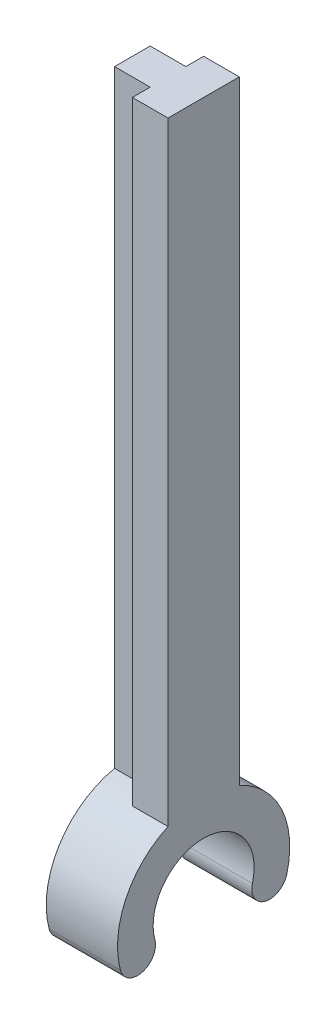
ISO-10303-21;
HEADER;
FILE_DESCRIPTION(('STEP AP214'),'2;1');
FILE_NAME('part.step','',(''),(''),'','','');
FILE_SCHEMA(('AUTOMOTIVE_DESIGN { 1 0 10303 214 1 1 1 1 }'));
ENDSEC;
DATA;
#1=APPLICATION_CONTEXT('core data for automotive mechanical design processes');
#2=APPLICATION_PROTOCOL_DEFINITION('international standard','automotive_design',2000,#1);
#3=PRODUCT_CONTEXT('',#1,'mechanical');
#4=PRODUCT('Part','Part','',(#3));
#5=PRODUCT_RELATED_PRODUCT_CATEGORY('part','',(#4));
#6=PRODUCT_DEFINITION_FORMATION('','',#4);
#7=PRODUCT_DEFINITION_CONTEXT('part definition',#1,'design');
#8=PRODUCT_DEFINITION('design','',#6,#7);
#9=PRODUCT_DEFINITION_SHAPE('','',#8);
#10=(LENGTH_UNIT() NAMED_UNIT(*) SI_UNIT(.MILLI.,.METRE.));
#11=(NAMED_UNIT(*) PLANE_ANGLE_UNIT() SI_UNIT($,.RADIAN.));
#12=(NAMED_UNIT(*) SI_UNIT($,.STERADIAN.) SOLID_ANGLE_UNIT());
#13=UNCERTAINTY_MEASURE_WITH_UNIT(LENGTH_MEASURE(1.E-05),#10,'distance_accuracy_value','');
#14=(GEOMETRIC_REPRESENTATION_CONTEXT(3) GLOBAL_UNCERTAINTY_ASSIGNED_CONTEXT((#13)) GLOBAL_UNIT_ASSIGNED_CONTEXT((#10,
#11,#12)) REPRESENTATION_CONTEXT('',''));
#15=CARTESIAN_POINT('',(0.,0.,0.));
#16=DIRECTION('',(0.,0.,1.));
#17=DIRECTION('',(1.,0.,0.));
#18=AXIS2_PLACEMENT_3D('',#15,#16,#17);
#19=CARTESIAN_POINT('',(3.,0.,0.));
#20=DIRECTION('',(-1.,0.,0.));
#21=DIRECTION('',(0.,0.,1.));
#22=AXIS2_PLACEMENT_3D('',#19,#20,#21);
#23=CYLINDRICAL_SURFACE('',#22,7.25);
#24=DIRECTION('',(-1.,0.,0.));
#25=VECTOR('',#24,1.);
#26=CARTESIAN_POINT('',(3.,7.09313047955555,-1.50000000000001));
#27=LINE('',#26,#25);
#28=CARTESIAN_POINT('',(0.,7.09313047955555,-1.50000000000001));
#29=VERTEX_POINT('',#28);
#30=CARTESIAN_POINT('',(-3.,7.09313047955555,-1.50000000000001));
#31=VERTEX_POINT('',#30);
#32=EDGE_CURVE('E157',#29,#31,#27,.T.);
#33=ORIENTED_EDGE('',*,*,#32,.F.);
#34=CARTESIAN_POINT('',(0.,0.,0.));
#35=DIRECTION('',(1.,0.,0.));
#36=DIRECTION('',(0.,0.,-1.));
#37=AXIS2_PLACEMENT_3D('',#34,#35,#36);
#38=CIRCLE('',#37,7.25);
#39=CARTESIAN_POINT('',(0.,6.60018939122204,-3.));
#40=VERTEX_POINT('',#39);
#41=EDGE_CURVE('E11',#40,#29,#38,.T.);
#42=ORIENTED_EDGE('',*,*,#41,.F.);
#43=DIRECTION('',(-1.,0.,0.));
#44=VECTOR('',#43,1.);
#45=CARTESIAN_POINT('',(3.,6.60018939122204,-3.));
#46=LINE('',#45,#44);
#47=CARTESIAN_POINT('',(3.,6.60018939122204,-3.));
#48=VERTEX_POINT('',#47);
#49=EDGE_CURVE('E206',#48,#40,#46,.T.);
#50=ORIENTED_EDGE('',*,*,#49,.F.);
#51=CARTESIAN_POINT('',(3.,0.,0.));
#52=DIRECTION('',(1.,0.,0.));
#53=DIRECTION('',(0.,0.,-1.));
#54=AXIS2_PLACEMENT_3D('',#51,#52,#53);
#55=CIRCLE('',#54,7.25);
#56=CARTESIAN_POINT('',(3.,-1.87643807699328,-7.00296224059574));
#57=VERTEX_POINT('',#56);
#58=EDGE_CURVE('E234',#57,#48,#55,.T.);
#59=ORIENTED_EDGE('',*,*,#58,.F.);
#60=DIRECTION('',(-1.,0.,0.));
#61=VECTOR('',#60,1.);
#62=CARTESIAN_POINT('',(3.,-1.87643807699328,-7.00296224059574));
#63=LINE('',#62,#61);
#64=CARTESIAN_POINT('',(-3.,-1.87643807699328,-7.00296224059574));
#65=VERTEX_POINT('',#64);
#66=EDGE_CURVE('E248',#57,#65,#63,.T.);
#67=ORIENTED_EDGE('',*,*,#66,.T.);
#68=CARTESIAN_POINT('',(-3.,0.,0.));
#69=DIRECTION('',(1.,0.,0.));
#70=DIRECTION('',(0.,0.,-1.));
#71=AXIS2_PLACEMENT_3D('',#68,#69,#70);
#72=CIRCLE('',#71,7.25);
#73=EDGE_CURVE('E65',#65,#31,#72,.T.);
#74=ORIENTED_EDGE('',*,*,#73,.T.);
#75=EDGE_LOOP('',(#33,#42,#50,#59,#67,#74));
#76=FACE_BOUND('',#75,.T.);
#77=ADVANCED_FACE('F41',(#76),#23,.T.);
#78=CARTESIAN_POINT('',(0.,0.,0.));
#79=DIRECTION('',(1.,0.,0.));
#80=DIRECTION('',(0.,0.,-1.));
#81=AXIS2_PLACEMENT_3D('',#78,#79,#80);
#82=PLANE('',#81);
#83=DIRECTION('',(0.,-1.,0.));
#84=VECTOR('',#83,1.);
#85=CARTESIAN_POINT('',(0.,0.,-1.50000000000001));
#86=LINE('',#85,#84);
#87=CARTESIAN_POINT('',(0.,58.25,-1.5));
#88=VERTEX_POINT('',#87);
#89=EDGE_CURVE('E162',#88,#29,#86,.T.);
#90=ORIENTED_EDGE('',*,*,#89,.F.);
#91=DIRECTION('',(0.,0.,-1.));
#92=VECTOR('',#91,1.);
#93=CARTESIAN_POINT('',(0.,58.25,0.));
#94=LINE('',#93,#92);
#95=CARTESIAN_POINT('',(0.,58.25,-3.));
#96=VERTEX_POINT('',#95);
#97=EDGE_CURVE('E149',#88,#96,#94,.T.);
#98=ORIENTED_EDGE('',*,*,#97,.T.);
#99=DIRECTION('',(0.,1.,0.));
#100=VECTOR('',#99,1.);
#101=CARTESIAN_POINT('',(0.,0.,-3.));
#102=LINE('',#101,#100);
#103=EDGE_CURVE('E175',#40,#96,#102,.T.);
#104=ORIENTED_EDGE('',*,*,#103,.F.);
#105=ORIENTED_EDGE('',*,*,#41,.T.);
#106=EDGE_LOOP('',(#90,#98,#104,#105));
#107=FACE_BOUND('',#106,.T.);
#108=ADVANCED_FACE('F276',(#107),#82,.F.);
#109=CARTESIAN_POINT('',(0.,7.09313047955556,1.49999999999999));
#110=VERTEX_POINT('',#109);
#111=CARTESIAN_POINT('',(0.,6.60018939122204,3.));
#112=VERTEX_POINT('',#111);
#113=EDGE_CURVE('E50',#110,#112,#38,.T.);
#114=ORIENTED_EDGE('',*,*,#113,.F.);
#115=DIRECTION('',(-1.,0.,0.));
#116=VECTOR('',#115,1.);
#117=CARTESIAN_POINT('',(3.,7.09313047955556,1.49999999999999));
#118=LINE('',#117,#116);
#119=CARTESIAN_POINT('',(-3.,7.09313047955556,1.49999999999999));
#120=VERTEX_POINT('',#119);
#121=EDGE_CURVE('E57',#110,#120,#118,.T.);
#122=ORIENTED_EDGE('',*,*,#121,.T.);
#123=CARTESIAN_POINT('',(-3.,-1.87643807699328,7.00296224059574));
#124=VERTEX_POINT('',#123);
#125=EDGE_CURVE('E218',#120,#124,#72,.T.);
#126=ORIENTED_EDGE('',*,*,#125,.T.);
#127=DIRECTION('',(-1.,0.,0.));
#128=VECTOR('',#127,1.);
#129=CARTESIAN_POINT('',(3.,-1.87643807699328,7.00296224059574));
#130=LINE('',#129,#128);
#131=CARTESIAN_POINT('',(3.,-1.87643807699328,7.00296224059574));
#132=VERTEX_POINT('',#131);
#133=EDGE_CURVE('E244',#132,#124,#130,.T.);
#134=ORIENTED_EDGE('',*,*,#133,.F.);
#135=CARTESIAN_POINT('',(3.,6.60018939122204,3.));
#136=VERTEX_POINT('',#135);
#137=EDGE_CURVE('E233',#136,#132,#55,.T.);
#138=ORIENTED_EDGE('',*,*,#137,.F.);
#139=DIRECTION('',(-1.,0.,0.));
#140=VECTOR('',#139,1.);
#141=CARTESIAN_POINT('',(3.,6.60018939122204,3.));
#142=LINE('',#141,#140);
#143=EDGE_CURVE('E202',#136,#112,#142,.T.);
#144=ORIENTED_EDGE('',*,*,#143,.T.);
#145=EDGE_LOOP('',(#114,#122,#126,#134,#138,#144));
#146=FACE_BOUND('',#145,.T.);
#147=ADVANCED_FACE('F260',(#146),#23,.T.);
#148=CARTESIAN_POINT('',(3.,0.,0.));
#149=DIRECTION('',(-1.,0.,0.));
#150=DIRECTION('',(0.,0.,1.));
#151=AXIS2_PLACEMENT_3D('',#148,#149,#150);
#152=CYLINDRICAL_SURFACE('',#151,4.25);
#153=DIRECTION('',(-1.,0.,0.));
#154=VECTOR('',#153,1.);
#155=CARTESIAN_POINT('',(3.,-1.09998094168572,4.10518476172854));
#156=LINE('',#155,#154);
#157=CARTESIAN_POINT('',(3.,-1.09998094168572,4.10518476172854));
#158=VERTEX_POINT('',#157);
#159=CARTESIAN_POINT('',(-3.,-1.09998094168572,4.10518476172854));
#160=VERTEX_POINT('',#159);
#161=EDGE_CURVE('E241',#158,#160,#156,.T.);
#162=ORIENTED_EDGE('',*,*,#161,.T.);
#163=CARTESIAN_POINT('',(-3.,0.,0.));
#164=DIRECTION('',(1.,0.,0.));
#165=DIRECTION('',(0.,0.,-1.));
#166=AXIS2_PLACEMENT_3D('',#163,#164,#165);
#167=CIRCLE('',#166,4.25);
#168=CARTESIAN_POINT('',(-3.,-1.09998094168572,-4.10518476172854));
#169=VERTEX_POINT('',#168);
#170=EDGE_CURVE('E210',#169,#160,#167,.T.);
#171=ORIENTED_EDGE('',*,*,#170,.F.);
#172=DIRECTION('',(-1.,0.,0.));
#173=VECTOR('',#172,1.);
#174=CARTESIAN_POINT('',(3.,-1.09998094168572,-4.10518476172854));
#175=LINE('',#174,#173);
#176=CARTESIAN_POINT('',(3.,-1.09998094168572,-4.10518476172854));
#177=VERTEX_POINT('',#176);
#178=EDGE_CURVE('E250',#177,#169,#175,.T.);
#179=ORIENTED_EDGE('',*,*,#178,.F.);
#180=CARTESIAN_POINT('',(3.,0.,0.));
#181=DIRECTION('',(1.,0.,0.));
#182=DIRECTION('',(0.,0.,-1.));
#183=AXIS2_PLACEMENT_3D('',#180,#181,#182);
#184=CIRCLE('',#183,4.25);
#185=EDGE_CURVE('E225',#177,#158,#184,.T.);
#186=ORIENTED_EDGE('',*,*,#185,.T.);
#187=EDGE_LOOP('',(#162,#171,#179,#186));
#188=FACE_BOUND('',#187,.T.);
#189=ADVANCED_FACE('F43',(#188),#152,.F.);
#190=CARTESIAN_POINT('',(3.,-1.4882095093395,-5.55407350116214));
#191=DIRECTION('',(-1.,0.,0.));
#192=DIRECTION('',(0.,0.,1.));
#193=AXIS2_PLACEMENT_3D('',#190,#191,#192);
#194=CYLINDRICAL_SURFACE('',#193,1.5);
#195=ORIENTED_EDGE('',*,*,#178,.T.);
#196=CARTESIAN_POINT('',(-3.,-1.4882095093395,-5.55407350116214));
#197=DIRECTION('',(1.,0.,0.));
#198=DIRECTION('',(0.,0.,-1.));
#199=AXIS2_PLACEMENT_3D('',#196,#197,#198);
#200=CIRCLE('',#199,1.5);
#201=EDGE_CURVE('E214',#65,#169,#200,.F.);
#202=ORIENTED_EDGE('',*,*,#201,.F.);
#203=ORIENTED_EDGE('',*,*,#66,.F.);
#204=CARTESIAN_POINT('',(3.,-1.4882095093395,-5.55407350116214));
#205=DIRECTION('',(1.,0.,0.));
#206=DIRECTION('',(0.,0.,-1.));
#207=AXIS2_PLACEMENT_3D('',#204,#205,#206);
#208=CIRCLE('',#207,1.5);
#209=EDGE_CURVE('E229',#57,#177,#208,.F.);
#210=ORIENTED_EDGE('',*,*,#209,.T.);
#211=EDGE_LOOP('',(#195,#202,#203,#210));
#212=FACE_BOUND('',#211,.T.);
#213=ADVANCED_FACE('F288',(#212),#194,.T.);
#214=CARTESIAN_POINT('',(3.,-1.4882095093395,5.55407350116214));
#215=DIRECTION('',(-1.,0.,0.));
#216=DIRECTION('',(0.,0.,1.));
#217=AXIS2_PLACEMENT_3D('',#214,#215,#216);
#218=CYLINDRICAL_SURFACE('',#217,1.5);
#219=ORIENTED_EDGE('',*,*,#133,.T.);
#220=CARTESIAN_POINT('',(-3.,-1.4882095093395,5.55407350116214));
#221=DIRECTION('',(1.,0.,0.));
#222=DIRECTION('',(0.,0.,-1.));
#223=AXIS2_PLACEMENT_3D('',#220,#221,#222);
#224=CIRCLE('',#223,1.5);
#225=EDGE_CURVE('E221',#124,#160,#224,.T.);
#226=ORIENTED_EDGE('',*,*,#225,.T.);
#227=ORIENTED_EDGE('',*,*,#161,.F.);
#228=CARTESIAN_POINT('',(3.,-1.4882095093395,5.55407350116214));
#229=DIRECTION('',(1.,0.,0.));
#230=DIRECTION('',(0.,0.,-1.));
#231=AXIS2_PLACEMENT_3D('',#228,#229,#230);
#232=CIRCLE('',#231,1.5);
#233=EDGE_CURVE('E238',#132,#158,#232,.T.);
#234=ORIENTED_EDGE('',*,*,#233,.F.);
#235=EDGE_LOOP('',(#219,#226,#227,#234));
#236=FACE_BOUND('',#235,.T.);
#237=ADVANCED_FACE('F293',(#236),#218,.T.);
#238=CARTESIAN_POINT('',(3.,0.,0.));
#239=DIRECTION('',(1.,0.,0.));
#240=DIRECTION('',(0.,0.,-1.));
#241=AXIS2_PLACEMENT_3D('',#238,#239,#240);
#242=PLANE('',#241);
#243=ORIENTED_EDGE('',*,*,#58,.T.);
#244=DIRECTION('',(0.,1.,0.));
#245=VECTOR('',#244,1.);
#246=CARTESIAN_POINT('',(3.,0.,-3.));
#247=LINE('',#246,#245);
#248=CARTESIAN_POINT('',(3.,58.25,-3.));
#249=VERTEX_POINT('',#248);
#250=EDGE_CURVE('E176',#48,#249,#247,.T.);
#251=ORIENTED_EDGE('',*,*,#250,.T.);
#252=DIRECTION('',(0.,0.,-1.));
#253=VECTOR('',#252,1.);
#254=CARTESIAN_POINT('',(3.,58.25,0.));
#255=LINE('',#254,#253);
#256=CARTESIAN_POINT('',(3.,58.25,3.));
#257=VERTEX_POINT('',#256);
#258=EDGE_CURVE('E179',#257,#249,#255,.T.);
#259=ORIENTED_EDGE('',*,*,#258,.F.);
#260=DIRECTION('',(0.,1.,0.));
#261=VECTOR('',#260,1.);
#262=CARTESIAN_POINT('',(3.,0.,3.));
#263=LINE('',#262,#261);
#264=EDGE_CURVE('E184',#136,#257,#263,.T.);
#265=ORIENTED_EDGE('',*,*,#264,.F.);
#266=ORIENTED_EDGE('',*,*,#137,.T.);
#267=ORIENTED_EDGE('',*,*,#233,.T.);
#268=ORIENTED_EDGE('',*,*,#185,.F.);
#269=ORIENTED_EDGE('',*,*,#209,.F.);
#270=EDGE_LOOP('',(#243,#251,#259,#265,#266,#267,#268,#269));
#271=FACE_BOUND('',#270,.T.);
#272=ADVANCED_FACE('F308',(#271),#242,.T.);
#273=CARTESIAN_POINT('',(-3.,0.,0.));
#274=DIRECTION('',(1.,0.,0.));
#275=DIRECTION('',(0.,0.,-1.));
#276=AXIS2_PLACEMENT_3D('',#273,#274,#275);
#277=PLANE('',#276);
#278=ORIENTED_EDGE('',*,*,#125,.F.);
#279=DIRECTION('',(0.,-1.,0.));
#280=VECTOR('',#279,1.);
#281=CARTESIAN_POINT('',(-3.,0.,1.49999999999999));
#282=LINE('',#281,#280);
#283=CARTESIAN_POINT('',(-3.,58.25,1.5));
#284=VERTEX_POINT('',#283);
#285=EDGE_CURVE('E139',#284,#120,#282,.T.);
#286=ORIENTED_EDGE('',*,*,#285,.F.);
#287=DIRECTION('',(0.,0.,-1.));
#288=VECTOR('',#287,1.);
#289=CARTESIAN_POINT('',(-3.,58.25,0.));
#290=LINE('',#289,#288);
#291=CARTESIAN_POINT('',(-3.,58.25,-1.5));
#292=VERTEX_POINT('',#291);
#293=EDGE_CURVE('E133',#284,#292,#290,.T.);
#294=ORIENTED_EDGE('',*,*,#293,.T.);
#295=DIRECTION('',(0.,-1.,0.));
#296=VECTOR('',#295,1.);
#297=CARTESIAN_POINT('',(-3.,0.,-1.50000000000001));
#298=LINE('',#297,#296);
#299=EDGE_CURVE('E137',#292,#31,#298,.T.);
#300=ORIENTED_EDGE('',*,*,#299,.T.);
#301=ORIENTED_EDGE('',*,*,#73,.F.);
#302=ORIENTED_EDGE('',*,*,#201,.T.);
#303=ORIENTED_EDGE('',*,*,#170,.T.);
#304=ORIENTED_EDGE('',*,*,#225,.F.);
#305=EDGE_LOOP('',(#278,#286,#294,#300,#301,#302,#303,#304));
#306=FACE_BOUND('',#305,.T.);
#307=ADVANCED_FACE('F135',(#306),#277,.F.);
#308=CARTESIAN_POINT('',(3.,0.,-3.));
#309=DIRECTION('',(0.,0.,1.));
#310=DIRECTION('',(1.,0.,0.));
#311=AXIS2_PLACEMENT_3D('',#308,#309,#310);
#312=PLANE('',#311);
#313=ORIENTED_EDGE('',*,*,#250,.F.);
#314=ORIENTED_EDGE('',*,*,#49,.T.);
#315=ORIENTED_EDGE('',*,*,#103,.T.);
#316=DIRECTION('',(-1.,0.,0.));
#317=VECTOR('',#316,1.);
#318=CARTESIAN_POINT('',(3.,58.25,-3.));
#319=LINE('',#318,#317);
#320=EDGE_CURVE('E199',#249,#96,#319,.T.);
#321=ORIENTED_EDGE('',*,*,#320,.F.);
#322=EDGE_LOOP('',(#313,#314,#315,#321));
#323=FACE_BOUND('',#322,.T.);
#324=ADVANCED_FACE('F306',(#323),#312,.F.);
#325=CARTESIAN_POINT('',(3.,0.,3.));
#326=DIRECTION('',(0.,0.,1.));
#327=DIRECTION('',(0.,-1.,0.));
#328=AXIS2_PLACEMENT_3D('',#325,#326,#327);
#329=PLANE('',#328);
#330=ORIENTED_EDGE('',*,*,#143,.F.);
#331=ORIENTED_EDGE('',*,*,#264,.T.);
#332=DIRECTION('',(-1.,0.,0.));
#333=VECTOR('',#332,1.);
#334=CARTESIAN_POINT('',(3.,58.25,3.));
#335=LINE('',#334,#333);
#336=CARTESIAN_POINT('',(0.,58.25,3.));
#337=VERTEX_POINT('',#336);
#338=EDGE_CURVE('E187',#257,#337,#335,.T.);
#339=ORIENTED_EDGE('',*,*,#338,.T.);
#340=DIRECTION('',(0.,1.,0.));
#341=VECTOR('',#340,1.);
#342=CARTESIAN_POINT('',(0.,0.,3.));
#343=LINE('',#342,#341);
#344=EDGE_CURVE('E180',#112,#337,#343,.T.);
#345=ORIENTED_EDGE('',*,*,#344,.F.);
#346=EDGE_LOOP('',(#330,#331,#339,#345));
#347=FACE_BOUND('',#346,.T.);
#348=ADVANCED_FACE('F264',(#347),#329,.T.);
#349=CARTESIAN_POINT('',(3.,58.25,0.));
#350=DIRECTION('',(0.,1.,0.));
#351=DIRECTION('',(0.,0.,1.));
#352=AXIS2_PLACEMENT_3D('',#349,#350,#351);
#353=PLANE('',#352);
#354=CARTESIAN_POINT('',(0.,58.25,1.5));
#355=VERTEX_POINT('',#354);
#356=EDGE_CURVE('E191',#337,#355,#94,.T.);
#357=ORIENTED_EDGE('',*,*,#356,.F.);
#358=ORIENTED_EDGE('',*,*,#338,.F.);
#359=ORIENTED_EDGE('',*,*,#258,.T.);
#360=ORIENTED_EDGE('',*,*,#320,.T.);
#361=ORIENTED_EDGE('',*,*,#97,.F.);
#362=DIRECTION('',(1.,0.,0.));
#363=VECTOR('',#362,1.);
#364=CARTESIAN_POINT('',(-3.,58.25,-1.5));
#365=LINE('',#364,#363);
#366=EDGE_CURVE('E145',#292,#88,#365,.T.);
#367=ORIENTED_EDGE('',*,*,#366,.F.);
#368=ORIENTED_EDGE('',*,*,#293,.F.);
#369=DIRECTION('',(1.,0.,0.));
#370=VECTOR('',#369,1.);
#371=CARTESIAN_POINT('',(-3.,58.25,1.5));
#372=LINE('',#371,#370);
#373=EDGE_CURVE('E154',#284,#355,#372,.T.);
#374=ORIENTED_EDGE('',*,*,#373,.T.);
#375=EDGE_LOOP('',(#357,#358,#359,#360,#361,#367,#368,#374));
#376=FACE_BOUND('',#375,.T.);
#377=ADVANCED_FACE('F147',(#376),#353,.T.);
#378=ORIENTED_EDGE('',*,*,#356,.T.);
#379=DIRECTION('',(0.,-1.,0.));
#380=VECTOR('',#379,1.);
#381=CARTESIAN_POINT('',(0.,0.,1.49999999999999));
#382=LINE('',#381,#380);
#383=EDGE_CURVE('E159',#355,#110,#382,.T.);
#384=ORIENTED_EDGE('',*,*,#383,.T.);
#385=ORIENTED_EDGE('',*,*,#113,.T.);
#386=ORIENTED_EDGE('',*,*,#344,.T.);
#387=EDGE_LOOP('',(#378,#384,#385,#386));
#388=FACE_BOUND('',#387,.T.);
#389=ADVANCED_FACE('F256',(#388),#82,.F.);
#390=CARTESIAN_POINT('',(-3.,0.,-1.50000000000001));
#391=DIRECTION('',(0.,0.,1.));
#392=DIRECTION('',(0.,-1.,0.));
#393=AXIS2_PLACEMENT_3D('',#390,#391,#392);
#394=PLANE('',#393);
#395=ORIENTED_EDGE('',*,*,#89,.T.);
#396=ORIENTED_EDGE('',*,*,#32,.T.);
#397=ORIENTED_EDGE('',*,*,#299,.F.);
#398=ORIENTED_EDGE('',*,*,#366,.T.);
#399=EDGE_LOOP('',(#395,#396,#397,#398));
#400=FACE_BOUND('',#399,.T.);
#401=ADVANCED_FACE('F156',(#400),#394,.F.);
#402=CARTESIAN_POINT('',(-3.,0.,1.49999999999999));
#403=DIRECTION('',(0.,0.,1.));
#404=DIRECTION('',(0.,-1.,0.));
#405=AXIS2_PLACEMENT_3D('',#402,#403,#404);
#406=PLANE('',#405);
#407=ORIENTED_EDGE('',*,*,#121,.F.);
#408=ORIENTED_EDGE('',*,*,#383,.F.);
#409=ORIENTED_EDGE('',*,*,#373,.F.);
#410=ORIENTED_EDGE('',*,*,#285,.T.);
#411=EDGE_LOOP('',(#407,#408,#409,#410));
#412=FACE_BOUND('',#411,.T.);
#413=ADVANCED_FACE('F268',(#412),#406,.T.);
#414=CLOSED_SHELL('',(#77,#108,#147,#189,#213,#237,#272,#307,#324,#348,#377,#389,#401,#413));
#415=MANIFOLD_SOLID_BREP('B2',#414);
#416=ADVANCED_BREP_SHAPE_REPRESENTATION('',(#18,#415),#14);
#417=SHAPE_DEFINITION_REPRESENTATION(#9,#416);
ENDSEC;
END-ISO-10303-21;
